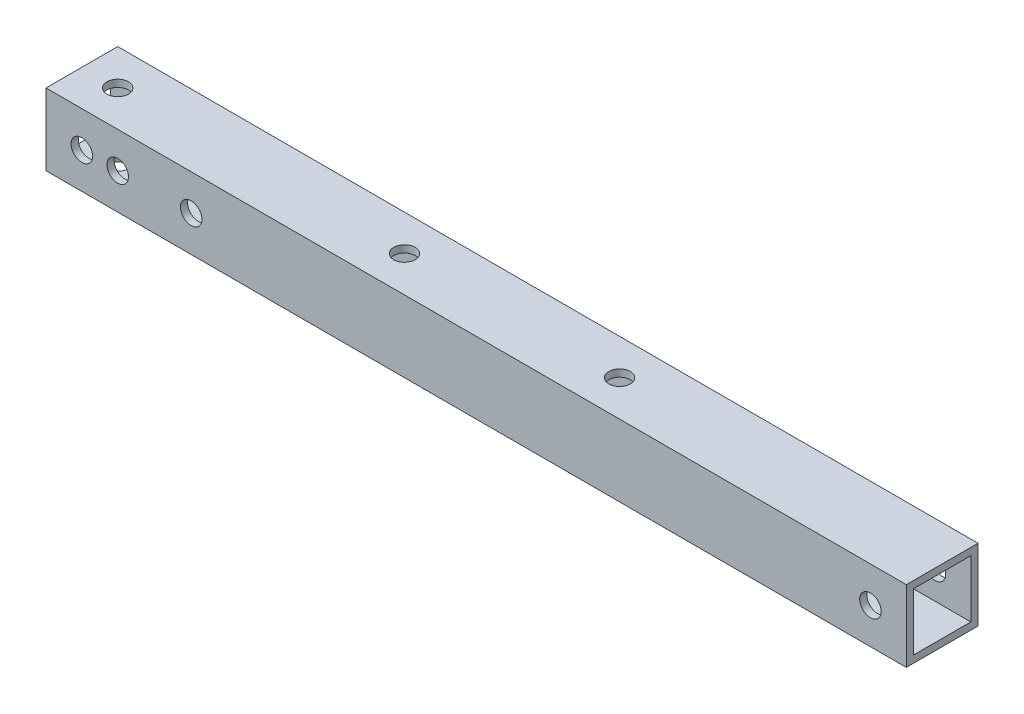
ISO-10303-21;
HEADER;
FILE_DESCRIPTION(('STEP AP214'),'2;1');
FILE_NAME('part.step','',(''),(''),'','','');
FILE_SCHEMA(('AUTOMOTIVE_DESIGN { 1 0 10303 214 1 1 1 1 }'));
ENDSEC;
DATA;
#1=APPLICATION_CONTEXT('core data for automotive mechanical design processes');
#2=APPLICATION_PROTOCOL_DEFINITION('international standard','automotive_design',2000,#1);
#3=PRODUCT_CONTEXT('',#1,'mechanical');
#4=PRODUCT('Part','Part','',(#3));
#5=PRODUCT_RELATED_PRODUCT_CATEGORY('part','',(#4));
#6=PRODUCT_DEFINITION_FORMATION('','',#4);
#7=PRODUCT_DEFINITION_CONTEXT('part definition',#1,'design');
#8=PRODUCT_DEFINITION('design','',#6,#7);
#9=PRODUCT_DEFINITION_SHAPE('','',#8);
#10=(LENGTH_UNIT() NAMED_UNIT(*) SI_UNIT(.MILLI.,.METRE.));
#11=(NAMED_UNIT(*) PLANE_ANGLE_UNIT() SI_UNIT($,.RADIAN.));
#12=(NAMED_UNIT(*) SI_UNIT($,.STERADIAN.) SOLID_ANGLE_UNIT());
#13=UNCERTAINTY_MEASURE_WITH_UNIT(LENGTH_MEASURE(1.E-05),#10,'distance_accuracy_value','');
#14=(GEOMETRIC_REPRESENTATION_CONTEXT(3) GLOBAL_UNCERTAINTY_ASSIGNED_CONTEXT((#13)) GLOBAL_UNIT_ASSIGNED_CONTEXT((#10,
#11,#12)) REPRESENTATION_CONTEXT('',''));
#15=CARTESIAN_POINT('',(0.,0.,0.));
#16=DIRECTION('',(0.,0.,1.));
#17=DIRECTION('',(1.,0.,0.));
#18=AXIS2_PLACEMENT_3D('',#15,#16,#17);
#19=CARTESIAN_POINT('',(120.,0.,0.));
#20=DIRECTION('',(1.,0.,0.));
#21=DIRECTION('',(0.,0.,-1.));
#22=AXIS2_PLACEMENT_3D('',#19,#20,#21);
#23=PLANE('',#22);
#24=DIRECTION('',(0.,1.,0.));
#25=VECTOR('',#24,1.);
#26=CARTESIAN_POINT('',(120.,-5.,-5.));
#27=LINE('',#26,#25);
#28=CARTESIAN_POINT('',(120.,-5.,-5.));
#29=VERTEX_POINT('',#28);
#30=CARTESIAN_POINT('',(120.,5.,-5.));
#31=VERTEX_POINT('',#30);
#32=EDGE_CURVE('E181',#29,#31,#27,.T.);
#33=ORIENTED_EDGE('',*,*,#32,.T.);
#34=DIRECTION('',(0.,0.,1.));
#35=VECTOR('',#34,1.);
#36=CARTESIAN_POINT('',(120.,5.,5.));
#37=LINE('',#36,#35);
#38=CARTESIAN_POINT('',(120.,5.,5.));
#39=VERTEX_POINT('',#38);
#40=EDGE_CURVE('E185',#31,#39,#37,.T.);
#41=ORIENTED_EDGE('',*,*,#40,.T.);
#42=DIRECTION('',(0.,-1.,0.));
#43=VECTOR('',#42,1.);
#44=CARTESIAN_POINT('',(120.,-5.,5.));
#45=LINE('',#44,#43);
#46=CARTESIAN_POINT('',(120.,-5.,5.));
#47=VERTEX_POINT('',#46);
#48=EDGE_CURVE('E189',#39,#47,#45,.T.);
#49=ORIENTED_EDGE('',*,*,#48,.T.);
#50=DIRECTION('',(0.,0.,-1.));
#51=VECTOR('',#50,1.);
#52=CARTESIAN_POINT('',(120.,-5.,5.));
#53=LINE('',#52,#51);
#54=EDGE_CURVE('E192',#47,#29,#53,.T.);
#55=ORIENTED_EDGE('',*,*,#54,.T.);
#56=EDGE_LOOP('',(#33,#41,#49,#55));
#57=FACE_BOUND('',#56,.T.);
#58=DIRECTION('',(0.,0.,1.));
#59=VECTOR('',#58,1.);
#60=CARTESIAN_POINT('',(120.,4.,0.));
#61=LINE('',#60,#59);
#62=CARTESIAN_POINT('',(120.,4.,-4.));
#63=VERTEX_POINT('',#62);
#64=CARTESIAN_POINT('',(120.,4.,4.));
#65=VERTEX_POINT('',#64);
#66=EDGE_CURVE('E140',#63,#65,#61,.T.);
#67=ORIENTED_EDGE('',*,*,#66,.F.);
#68=DIRECTION('',(0.,1.,0.));
#69=VECTOR('',#68,1.);
#70=CARTESIAN_POINT('',(120.,0.,-4.));
#71=LINE('',#70,#69);
#72=CARTESIAN_POINT('',(120.,-4.,-4.));
#73=VERTEX_POINT('',#72);
#74=EDGE_CURVE('E131',#73,#63,#71,.T.);
#75=ORIENTED_EDGE('',*,*,#74,.F.);
#76=DIRECTION('',(0.,0.,-1.));
#77=VECTOR('',#76,1.);
#78=CARTESIAN_POINT('',(120.,-4.,0.));
#79=LINE('',#78,#77);
#80=CARTESIAN_POINT('',(120.,-4.,4.));
#81=VERTEX_POINT('',#80);
#82=EDGE_CURVE('E157',#81,#73,#79,.T.);
#83=ORIENTED_EDGE('',*,*,#82,.F.);
#84=DIRECTION('',(0.,-1.,0.));
#85=VECTOR('',#84,1.);
#86=CARTESIAN_POINT('',(120.,0.,4.));
#87=LINE('',#86,#85);
#88=EDGE_CURVE('E153',#65,#81,#87,.T.);
#89=ORIENTED_EDGE('',*,*,#88,.F.);
#90=EDGE_LOOP('',(#67,#75,#83,#89));
#91=FACE_BOUND('',#90,.T.);
#92=ADVANCED_FACE('F63',(#57,#91),#23,.T.);
#93=CARTESIAN_POINT('',(0.,0.,0.));
#94=DIRECTION('',(1.,0.,0.));
#95=DIRECTION('',(0.,0.,-1.));
#96=AXIS2_PLACEMENT_3D('',#93,#94,#95);
#97=PLANE('',#96);
#98=DIRECTION('',(0.,1.,0.));
#99=VECTOR('',#98,1.);
#100=CARTESIAN_POINT('',(0.,-5.,-5.));
#101=LINE('',#100,#99);
#102=CARTESIAN_POINT('',(0.,-5.,-5.));
#103=VERTEX_POINT('',#102);
#104=CARTESIAN_POINT('',(0.,5.,-5.));
#105=VERTEX_POINT('',#104);
#106=EDGE_CURVE('E149',#103,#105,#101,.T.);
#107=ORIENTED_EDGE('',*,*,#106,.F.);
#108=DIRECTION('',(0.,0.,-1.));
#109=VECTOR('',#108,1.);
#110=CARTESIAN_POINT('',(0.,-5.,5.));
#111=LINE('',#110,#109);
#112=CARTESIAN_POINT('',(0.,-5.,5.));
#113=VERTEX_POINT('',#112);
#114=EDGE_CURVE('E186',#113,#103,#111,.T.);
#115=ORIENTED_EDGE('',*,*,#114,.F.);
#116=DIRECTION('',(0.,-1.,0.));
#117=VECTOR('',#116,1.);
#118=CARTESIAN_POINT('',(0.,-5.,5.));
#119=LINE('',#118,#117);
#120=CARTESIAN_POINT('',(0.,5.,5.));
#121=VERTEX_POINT('',#120);
#122=EDGE_CURVE('E202',#121,#113,#119,.T.);
#123=ORIENTED_EDGE('',*,*,#122,.F.);
#124=DIRECTION('',(0.,0.,1.));
#125=VECTOR('',#124,1.);
#126=CARTESIAN_POINT('',(0.,5.,5.));
#127=LINE('',#126,#125);
#128=EDGE_CURVE('E199',#105,#121,#127,.T.);
#129=ORIENTED_EDGE('',*,*,#128,.F.);
#130=EDGE_LOOP('',(#107,#115,#123,#129));
#131=FACE_BOUND('',#130,.T.);
#132=DIRECTION('',(0.,1.,0.));
#133=VECTOR('',#132,1.);
#134=CARTESIAN_POINT('',(0.,0.,-4.));
#135=LINE('',#134,#133);
#136=CARTESIAN_POINT('',(0.,-4.,-4.));
#137=VERTEX_POINT('',#136);
#138=CARTESIAN_POINT('',(0.,4.,-4.));
#139=VERTEX_POINT('',#138);
#140=EDGE_CURVE('E89',#137,#139,#135,.T.);
#141=ORIENTED_EDGE('',*,*,#140,.T.);
#142=DIRECTION('',(0.,0.,1.));
#143=VECTOR('',#142,1.);
#144=CARTESIAN_POINT('',(0.,4.,0.));
#145=LINE('',#144,#143);
#146=CARTESIAN_POINT('',(0.,4.,4.));
#147=VERTEX_POINT('',#146);
#148=EDGE_CURVE('E147',#139,#147,#145,.T.);
#149=ORIENTED_EDGE('',*,*,#148,.T.);
#150=DIRECTION('',(0.,-1.,0.));
#151=VECTOR('',#150,1.);
#152=CARTESIAN_POINT('',(0.,0.,4.));
#153=LINE('',#152,#151);
#154=CARTESIAN_POINT('',(0.,-4.,4.));
#155=VERTEX_POINT('',#154);
#156=EDGE_CURVE('E168',#147,#155,#153,.T.);
#157=ORIENTED_EDGE('',*,*,#156,.T.);
#158=DIRECTION('',(0.,0.,-1.));
#159=VECTOR('',#158,1.);
#160=CARTESIAN_POINT('',(0.,-4.,0.));
#161=LINE('',#160,#159);
#162=EDGE_CURVE('E141',#155,#137,#161,.T.);
#163=ORIENTED_EDGE('',*,*,#162,.T.);
#164=EDGE_LOOP('',(#141,#149,#157,#163));
#165=FACE_BOUND('',#164,.T.);
#166=ADVANCED_FACE('F332',(#131,#165),#97,.F.);
#167=CARTESIAN_POINT('',(120.,-5.,-5.));
#168=DIRECTION('',(0.,0.,1.));
#169=DIRECTION('',(1.,0.,0.));
#170=AXIS2_PLACEMENT_3D('',#167,#168,#169);
#171=PLANE('',#170);
#172=CARTESIAN_POINT('',(115.,0.,-5.));
#173=DIRECTION('',(0.,0.,1.));
#174=DIRECTION('',(1.,0.,0.));
#175=AXIS2_PLACEMENT_3D('',#172,#173,#174);
#176=CIRCLE('',#175,1.5);
#177=CARTESIAN_POINT('',(116.5,0.,-5.));
#178=VERTEX_POINT('',#177);
#179=EDGE_CURVE('E222',#178,#178,#176,.T.);
#180=ORIENTED_EDGE('',*,*,#179,.T.);
#181=EDGE_LOOP('',(#180));
#182=FACE_BOUND('',#181,.T.);
#183=CARTESIAN_POINT('',(10.,0.,-5.));
#184=DIRECTION('',(0.,0.,1.));
#185=DIRECTION('',(1.,0.,0.));
#186=AXIS2_PLACEMENT_3D('',#183,#184,#185);
#187=CIRCLE('',#186,1.5);
#188=CARTESIAN_POINT('',(11.5,0.,-5.));
#189=VERTEX_POINT('',#188);
#190=EDGE_CURVE('E272',#189,#189,#187,.T.);
#191=ORIENTED_EDGE('',*,*,#190,.T.);
#192=EDGE_LOOP('',(#191));
#193=FACE_BOUND('',#192,.T.);
#194=CARTESIAN_POINT('',(20.25,0.,-5.));
#195=DIRECTION('',(0.,0.,1.));
#196=DIRECTION('',(1.,0.,0.));
#197=AXIS2_PLACEMENT_3D('',#194,#195,#196);
#198=CIRCLE('',#197,1.5);
#199=CARTESIAN_POINT('',(21.75,0.,-5.));
#200=VERTEX_POINT('',#199);
#201=EDGE_CURVE('E280',#200,#200,#198,.T.);
#202=ORIENTED_EDGE('',*,*,#201,.T.);
#203=EDGE_LOOP('',(#202));
#204=FACE_BOUND('',#203,.T.);
#205=CARTESIAN_POINT('',(5.,0.,-5.));
#206=DIRECTION('',(0.,0.,1.));
#207=DIRECTION('',(1.,0.,0.));
#208=AXIS2_PLACEMENT_3D('',#205,#206,#207);
#209=CIRCLE('',#208,1.5);
#210=CARTESIAN_POINT('',(6.5,0.,-5.));
#211=VERTEX_POINT('',#210);
#212=EDGE_CURVE('E288',#211,#211,#209,.T.);
#213=ORIENTED_EDGE('',*,*,#212,.T.);
#214=EDGE_LOOP('',(#213));
#215=FACE_BOUND('',#214,.T.);
#216=ORIENTED_EDGE('',*,*,#106,.T.);
#217=DIRECTION('',(-1.,0.,0.));
#218=VECTOR('',#217,1.);
#219=CARTESIAN_POINT('',(120.,5.,-5.));
#220=LINE('',#219,#218);
#221=EDGE_CURVE('E12',#31,#105,#220,.T.);
#222=ORIENTED_EDGE('',*,*,#221,.F.);
#223=ORIENTED_EDGE('',*,*,#32,.F.);
#224=DIRECTION('',(-1.,0.,0.));
#225=VECTOR('',#224,1.);
#226=CARTESIAN_POINT('',(120.,-5.,-5.));
#227=LINE('',#226,#225);
#228=EDGE_CURVE('E195',#29,#103,#227,.T.);
#229=ORIENTED_EDGE('',*,*,#228,.T.);
#230=EDGE_LOOP('',(#216,#222,#223,#229));
#231=FACE_BOUND('',#230,.T.);
#232=ADVANCED_FACE('F65',(#182,#193,#204,#215,#231),#171,.F.);
#233=CARTESIAN_POINT('',(120.,5.,5.));
#234=DIRECTION('',(0.,-1.,0.));
#235=DIRECTION('',(0.,0.,-1.));
#236=AXIS2_PLACEMENT_3D('',#233,#234,#235);
#237=PLANE('',#236);
#238=CARTESIAN_POINT('',(5.,5.,0.));
#239=DIRECTION('',(0.,1.,0.));
#240=DIRECTION('',(0.,0.,1.));
#241=AXIS2_PLACEMENT_3D('',#238,#239,#240);
#242=CIRCLE('',#241,1.5);
#243=CARTESIAN_POINT('',(5.,5.,1.5));
#244=VERTEX_POINT('',#243);
#245=EDGE_CURVE('E423',#244,#244,#242,.T.);
#246=ORIENTED_EDGE('',*,*,#245,.F.);
#247=EDGE_LOOP('',(#246));
#248=FACE_BOUND('',#247,.T.);
#249=CARTESIAN_POINT('',(45.,5.,0.));
#250=DIRECTION('',(0.,1.,0.));
#251=DIRECTION('',(0.,0.,1.));
#252=AXIS2_PLACEMENT_3D('',#249,#250,#251);
#253=CIRCLE('',#252,1.5);
#254=CARTESIAN_POINT('',(45.,5.,1.5));
#255=VERTEX_POINT('',#254);
#256=EDGE_CURVE('E432',#255,#255,#253,.T.);
#257=ORIENTED_EDGE('',*,*,#256,.F.);
#258=EDGE_LOOP('',(#257));
#259=FACE_BOUND('',#258,.T.);
#260=CARTESIAN_POINT('',(75.,5.,0.));
#261=DIRECTION('',(0.,1.,0.));
#262=DIRECTION('',(0.,0.,-1.));
#263=AXIS2_PLACEMENT_3D('',#260,#261,#262);
#264=CIRCLE('',#263,1.5);
#265=CARTESIAN_POINT('',(75.,5.,-1.5));
#266=VERTEX_POINT('',#265);
#267=EDGE_CURVE('E257',#266,#266,#264,.T.);
#268=ORIENTED_EDGE('',*,*,#267,.F.);
#269=EDGE_LOOP('',(#268));
#270=FACE_BOUND('',#269,.T.);
#271=ORIENTED_EDGE('',*,*,#128,.T.);
#272=DIRECTION('',(-1.,0.,0.));
#273=VECTOR('',#272,1.);
#274=CARTESIAN_POINT('',(120.,5.,5.));
#275=LINE('',#274,#273);
#276=EDGE_CURVE('E73',#39,#121,#275,.T.);
#277=ORIENTED_EDGE('',*,*,#276,.F.);
#278=ORIENTED_EDGE('',*,*,#40,.F.);
#279=ORIENTED_EDGE('',*,*,#221,.T.);
#280=EDGE_LOOP('',(#271,#277,#278,#279));
#281=FACE_BOUND('',#280,.T.);
#282=ADVANCED_FACE('F331',(#248,#259,#270,#281),#237,.F.);
#283=CARTESIAN_POINT('',(120.,-5.,5.));
#284=DIRECTION('',(0.,0.,-1.));
#285=DIRECTION('',(-1.,0.,0.));
#286=AXIS2_PLACEMENT_3D('',#283,#284,#285);
#287=PLANE('',#286);
#288=CARTESIAN_POINT('',(115.,0.,5.));
#289=DIRECTION('',(0.,0.,1.));
#290=DIRECTION('',(1.,0.,0.));
#291=AXIS2_PLACEMENT_3D('',#288,#289,#290);
#292=CIRCLE('',#291,1.5);
#293=CARTESIAN_POINT('',(116.5,0.,5.));
#294=VERTEX_POINT('',#293);
#295=EDGE_CURVE('E268',#294,#294,#292,.T.);
#296=ORIENTED_EDGE('',*,*,#295,.F.);
#297=EDGE_LOOP('',(#296));
#298=FACE_BOUND('',#297,.T.);
#299=CARTESIAN_POINT('',(10.,0.,5.));
#300=DIRECTION('',(0.,0.,1.));
#301=DIRECTION('',(1.,0.,0.));
#302=AXIS2_PLACEMENT_3D('',#299,#300,#301);
#303=CIRCLE('',#302,1.5);
#304=CARTESIAN_POINT('',(11.5,0.,5.));
#305=VERTEX_POINT('',#304);
#306=EDGE_CURVE('E276',#305,#305,#303,.T.);
#307=ORIENTED_EDGE('',*,*,#306,.F.);
#308=EDGE_LOOP('',(#307));
#309=FACE_BOUND('',#308,.T.);
#310=CARTESIAN_POINT('',(20.25,0.,5.));
#311=DIRECTION('',(0.,0.,1.));
#312=DIRECTION('',(1.,0.,0.));
#313=AXIS2_PLACEMENT_3D('',#310,#311,#312);
#314=CIRCLE('',#313,1.5);
#315=CARTESIAN_POINT('',(21.75,0.,5.));
#316=VERTEX_POINT('',#315);
#317=EDGE_CURVE('E284',#316,#316,#314,.T.);
#318=ORIENTED_EDGE('',*,*,#317,.F.);
#319=EDGE_LOOP('',(#318));
#320=FACE_BOUND('',#319,.T.);
#321=CARTESIAN_POINT('',(5.,0.,5.));
#322=DIRECTION('',(0.,0.,1.));
#323=DIRECTION('',(1.,0.,0.));
#324=AXIS2_PLACEMENT_3D('',#321,#322,#323);
#325=CIRCLE('',#324,1.5);
#326=CARTESIAN_POINT('',(6.5,0.,5.));
#327=VERTEX_POINT('',#326);
#328=EDGE_CURVE('E264',#327,#327,#325,.T.);
#329=ORIENTED_EDGE('',*,*,#328,.F.);
#330=EDGE_LOOP('',(#329));
#331=FACE_BOUND('',#330,.T.);
#332=ORIENTED_EDGE('',*,*,#122,.T.);
#333=DIRECTION('',(-1.,0.,0.));
#334=VECTOR('',#333,1.);
#335=CARTESIAN_POINT('',(120.,-5.,5.));
#336=LINE('',#335,#334);
#337=EDGE_CURVE('E210',#47,#113,#336,.T.);
#338=ORIENTED_EDGE('',*,*,#337,.F.);
#339=ORIENTED_EDGE('',*,*,#48,.F.);
#340=ORIENTED_EDGE('',*,*,#276,.T.);
#341=EDGE_LOOP('',(#332,#338,#339,#340));
#342=FACE_BOUND('',#341,.T.);
#343=ADVANCED_FACE('F350',(#298,#309,#320,#331,#342),#287,.F.);
#344=CARTESIAN_POINT('',(120.,-5.,5.));
#345=DIRECTION('',(0.,1.,0.));
#346=DIRECTION('',(0.,0.,1.));
#347=AXIS2_PLACEMENT_3D('',#344,#345,#346);
#348=PLANE('',#347);
#349=CARTESIAN_POINT('',(5.,-5.,0.));
#350=DIRECTION('',(0.,1.,0.));
#351=DIRECTION('',(0.,0.,1.));
#352=AXIS2_PLACEMENT_3D('',#349,#350,#351);
#353=CIRCLE('',#352,1.5);
#354=CARTESIAN_POINT('',(5.,-5.,1.5));
#355=VERTEX_POINT('',#354);
#356=EDGE_CURVE('E241',#355,#355,#353,.T.);
#357=ORIENTED_EDGE('',*,*,#356,.T.);
#358=EDGE_LOOP('',(#357));
#359=FACE_BOUND('',#358,.T.);
#360=CARTESIAN_POINT('',(45.,-5.,0.));
#361=DIRECTION('',(0.,1.,0.));
#362=DIRECTION('',(0.,0.,1.));
#363=AXIS2_PLACEMENT_3D('',#360,#361,#362);
#364=CIRCLE('',#363,1.5);
#365=CARTESIAN_POINT('',(45.,-5.,1.5));
#366=VERTEX_POINT('',#365);
#367=EDGE_CURVE('E425',#366,#366,#364,.T.);
#368=ORIENTED_EDGE('',*,*,#367,.T.);
#369=EDGE_LOOP('',(#368));
#370=FACE_BOUND('',#369,.T.);
#371=CARTESIAN_POINT('',(75.,-5.,0.));
#372=DIRECTION('',(0.,1.,0.));
#373=DIRECTION('',(0.,0.,-1.));
#374=AXIS2_PLACEMENT_3D('',#371,#372,#373);
#375=CIRCLE('',#374,1.5);
#376=CARTESIAN_POINT('',(75.,-5.,-1.5));
#377=VERTEX_POINT('',#376);
#378=EDGE_CURVE('E437',#377,#377,#375,.T.);
#379=ORIENTED_EDGE('',*,*,#378,.T.);
#380=EDGE_LOOP('',(#379));
#381=FACE_BOUND('',#380,.T.);
#382=ORIENTED_EDGE('',*,*,#114,.T.);
#383=ORIENTED_EDGE('',*,*,#228,.F.);
#384=ORIENTED_EDGE('',*,*,#54,.F.);
#385=ORIENTED_EDGE('',*,*,#337,.T.);
#386=EDGE_LOOP('',(#382,#383,#384,#385));
#387=FACE_BOUND('',#386,.T.);
#388=ADVANCED_FACE('F312',(#359,#370,#381,#387),#348,.F.);
#389=CARTESIAN_POINT('',(120.,0.,-4.));
#390=DIRECTION('',(0.,0.,1.));
#391=DIRECTION('',(1.,0.,0.));
#392=AXIS2_PLACEMENT_3D('',#389,#390,#391);
#393=PLANE('',#392);
#394=CARTESIAN_POINT('',(115.,0.,-4.));
#395=DIRECTION('',(0.,0.,1.));
#396=DIRECTION('',(1.,0.,0.));
#397=AXIS2_PLACEMENT_3D('',#394,#395,#396);
#398=CIRCLE('',#397,1.5);
#399=CARTESIAN_POINT('',(116.5,0.,-4.));
#400=VERTEX_POINT('',#399);
#401=EDGE_CURVE('E165',#400,#400,#398,.T.);
#402=ORIENTED_EDGE('',*,*,#401,.F.);
#403=EDGE_LOOP('',(#402));
#404=FACE_BOUND('',#403,.T.);
#405=CARTESIAN_POINT('',(10.,0.,-4.));
#406=DIRECTION('',(0.,0.,1.));
#407=DIRECTION('',(1.,0.,0.));
#408=AXIS2_PLACEMENT_3D('',#405,#406,#407);
#409=CIRCLE('',#408,1.5);
#410=CARTESIAN_POINT('',(11.5,0.,-4.));
#411=VERTEX_POINT('',#410);
#412=EDGE_CURVE('E232',#411,#411,#409,.T.);
#413=ORIENTED_EDGE('',*,*,#412,.F.);
#414=EDGE_LOOP('',(#413));
#415=FACE_BOUND('',#414,.T.);
#416=CARTESIAN_POINT('',(20.25,0.,-4.));
#417=DIRECTION('',(0.,0.,1.));
#418=DIRECTION('',(1.,0.,0.));
#419=AXIS2_PLACEMENT_3D('',#416,#417,#418);
#420=CIRCLE('',#419,1.5);
#421=CARTESIAN_POINT('',(21.75,0.,-4.));
#422=VERTEX_POINT('',#421);
#423=EDGE_CURVE('E227',#422,#422,#420,.T.);
#424=ORIENTED_EDGE('',*,*,#423,.F.);
#425=EDGE_LOOP('',(#424));
#426=FACE_BOUND('',#425,.T.);
#427=CARTESIAN_POINT('',(5.,0.,-4.));
#428=DIRECTION('',(0.,0.,1.));
#429=DIRECTION('',(1.,0.,0.));
#430=AXIS2_PLACEMENT_3D('',#427,#428,#429);
#431=CIRCLE('',#430,1.5);
#432=CARTESIAN_POINT('',(6.5,0.,-4.));
#433=VERTEX_POINT('',#432);
#434=EDGE_CURVE('E221',#433,#433,#431,.T.);
#435=ORIENTED_EDGE('',*,*,#434,.F.);
#436=EDGE_LOOP('',(#435));
#437=FACE_BOUND('',#436,.T.);
#438=ORIENTED_EDGE('',*,*,#140,.F.);
#439=DIRECTION('',(-1.,0.,0.));
#440=VECTOR('',#439,1.);
#441=CARTESIAN_POINT('',(120.,-4.,-4.));
#442=LINE('',#441,#440);
#443=EDGE_CURVE('E135',#73,#137,#442,.T.);
#444=ORIENTED_EDGE('',*,*,#443,.F.);
#445=ORIENTED_EDGE('',*,*,#74,.T.);
#446=DIRECTION('',(-1.,0.,0.));
#447=VECTOR('',#446,1.);
#448=CARTESIAN_POINT('',(120.,4.,-4.));
#449=LINE('',#448,#447);
#450=EDGE_CURVE('E134',#63,#139,#449,.T.);
#451=ORIENTED_EDGE('',*,*,#450,.T.);
#452=EDGE_LOOP('',(#438,#444,#445,#451));
#453=FACE_BOUND('',#452,.T.);
#454=ADVANCED_FACE('F133',(#404,#415,#426,#437,#453),#393,.T.);
#455=CARTESIAN_POINT('',(120.,4.,0.));
#456=DIRECTION('',(0.,-1.,0.));
#457=DIRECTION('',(0.,0.,-1.));
#458=AXIS2_PLACEMENT_3D('',#455,#456,#457);
#459=PLANE('',#458);
#460=CARTESIAN_POINT('',(5.,4.,0.));
#461=DIRECTION('',(0.,-1.,0.));
#462=DIRECTION('',(0.,0.,-1.));
#463=AXIS2_PLACEMENT_3D('',#460,#461,#462);
#464=CIRCLE('',#463,1.5);
#465=CARTESIAN_POINT('',(5.,4.,-1.5));
#466=VERTEX_POINT('',#465);
#467=EDGE_CURVE('E260',#466,#466,#464,.T.);
#468=ORIENTED_EDGE('',*,*,#467,.F.);
#469=EDGE_LOOP('',(#468));
#470=FACE_BOUND('',#469,.T.);
#471=CARTESIAN_POINT('',(45.,4.,0.));
#472=DIRECTION('',(0.,-1.,0.));
#473=DIRECTION('',(0.,0.,-1.));
#474=AXIS2_PLACEMENT_3D('',#471,#472,#473);
#475=CIRCLE('',#474,1.5);
#476=CARTESIAN_POINT('',(45.,4.,-1.5));
#477=VERTEX_POINT('',#476);
#478=EDGE_CURVE('E245',#477,#477,#475,.T.);
#479=ORIENTED_EDGE('',*,*,#478,.F.);
#480=EDGE_LOOP('',(#479));
#481=FACE_BOUND('',#480,.T.);
#482=CARTESIAN_POINT('',(75.,4.,0.));
#483=DIRECTION('',(0.,-1.,0.));
#484=DIRECTION('',(0.,0.,-1.));
#485=AXIS2_PLACEMENT_3D('',#482,#483,#484);
#486=CIRCLE('',#485,1.5);
#487=CARTESIAN_POINT('',(75.,4.,-1.5));
#488=VERTEX_POINT('',#487);
#489=EDGE_CURVE('E240',#488,#488,#486,.T.);
#490=ORIENTED_EDGE('',*,*,#489,.F.);
#491=EDGE_LOOP('',(#490));
#492=FACE_BOUND('',#491,.T.);
#493=ORIENTED_EDGE('',*,*,#148,.F.);
#494=ORIENTED_EDGE('',*,*,#450,.F.);
#495=ORIENTED_EDGE('',*,*,#66,.T.);
#496=DIRECTION('',(-1.,0.,0.));
#497=VECTOR('',#496,1.);
#498=CARTESIAN_POINT('',(120.,4.,4.));
#499=LINE('',#498,#497);
#500=EDGE_CURVE('E150',#65,#147,#499,.T.);
#501=ORIENTED_EDGE('',*,*,#500,.T.);
#502=EDGE_LOOP('',(#493,#494,#495,#501));
#503=FACE_BOUND('',#502,.T.);
#504=ADVANCED_FACE('F144',(#470,#481,#492,#503),#459,.T.);
#505=CARTESIAN_POINT('',(120.,0.,4.));
#506=DIRECTION('',(0.,0.,-1.));
#507=DIRECTION('',(-1.,0.,0.));
#508=AXIS2_PLACEMENT_3D('',#505,#506,#507);
#509=PLANE('',#508);
#510=CARTESIAN_POINT('',(115.,0.,4.));
#511=DIRECTION('',(0.,0.,-1.));
#512=DIRECTION('',(-1.,0.,0.));
#513=AXIS2_PLACEMENT_3D('',#510,#511,#512);
#514=CIRCLE('',#513,1.5);
#515=CARTESIAN_POINT('',(113.5,0.,4.));
#516=VERTEX_POINT('',#515);
#517=EDGE_CURVE('E233',#516,#516,#514,.T.);
#518=ORIENTED_EDGE('',*,*,#517,.F.);
#519=EDGE_LOOP('',(#518));
#520=FACE_BOUND('',#519,.T.);
#521=CARTESIAN_POINT('',(10.,0.,4.));
#522=DIRECTION('',(0.,0.,-1.));
#523=DIRECTION('',(-1.,0.,0.));
#524=AXIS2_PLACEMENT_3D('',#521,#522,#523);
#525=CIRCLE('',#524,1.5);
#526=CARTESIAN_POINT('',(8.5,0.,4.));
#527=VERTEX_POINT('',#526);
#528=EDGE_CURVE('E228',#527,#527,#525,.T.);
#529=ORIENTED_EDGE('',*,*,#528,.F.);
#530=EDGE_LOOP('',(#529));
#531=FACE_BOUND('',#530,.T.);
#532=CARTESIAN_POINT('',(20.25,0.,4.));
#533=DIRECTION('',(0.,0.,-1.));
#534=DIRECTION('',(-1.,0.,0.));
#535=AXIS2_PLACEMENT_3D('',#532,#533,#534);
#536=CIRCLE('',#535,1.5);
#537=CARTESIAN_POINT('',(18.75,0.,4.));
#538=VERTEX_POINT('',#537);
#539=EDGE_CURVE('E223',#538,#538,#536,.T.);
#540=ORIENTED_EDGE('',*,*,#539,.F.);
#541=EDGE_LOOP('',(#540));
#542=FACE_BOUND('',#541,.T.);
#543=CARTESIAN_POINT('',(5.,0.,4.));
#544=DIRECTION('',(0.,0.,-1.));
#545=DIRECTION('',(-1.,0.,0.));
#546=AXIS2_PLACEMENT_3D('',#543,#544,#545);
#547=CIRCLE('',#546,1.5);
#548=CARTESIAN_POINT('',(3.5,0.,4.));
#549=VERTEX_POINT('',#548);
#550=EDGE_CURVE('E217',#549,#549,#547,.T.);
#551=ORIENTED_EDGE('',*,*,#550,.F.);
#552=EDGE_LOOP('',(#551));
#553=FACE_BOUND('',#552,.T.);
#554=ORIENTED_EDGE('',*,*,#156,.F.);
#555=ORIENTED_EDGE('',*,*,#500,.F.);
#556=ORIENTED_EDGE('',*,*,#88,.T.);
#557=DIRECTION('',(-1.,0.,0.));
#558=VECTOR('',#557,1.);
#559=CARTESIAN_POINT('',(120.,-4.,4.));
#560=LINE('',#559,#558);
#561=EDGE_CURVE('E81',#81,#155,#560,.T.);
#562=ORIENTED_EDGE('',*,*,#561,.T.);
#563=EDGE_LOOP('',(#554,#555,#556,#562));
#564=FACE_BOUND('',#563,.T.);
#565=ADVANCED_FACE('F372',(#520,#531,#542,#553,#564),#509,.T.);
#566=CARTESIAN_POINT('',(120.,-4.,0.));
#567=DIRECTION('',(0.,1.,0.));
#568=DIRECTION('',(0.,0.,1.));
#569=AXIS2_PLACEMENT_3D('',#566,#567,#568);
#570=PLANE('',#569);
#571=CARTESIAN_POINT('',(5.,-4.,0.));
#572=DIRECTION('',(0.,1.,0.));
#573=DIRECTION('',(0.,0.,1.));
#574=AXIS2_PLACEMENT_3D('',#571,#572,#573);
#575=CIRCLE('',#574,1.5);
#576=CARTESIAN_POINT('',(5.,-4.,1.5));
#577=VERTEX_POINT('',#576);
#578=EDGE_CURVE('E67',#577,#577,#575,.T.);
#579=ORIENTED_EDGE('',*,*,#578,.F.);
#580=EDGE_LOOP('',(#579));
#581=FACE_BOUND('',#580,.T.);
#582=CARTESIAN_POINT('',(45.,-4.,0.));
#583=DIRECTION('',(0.,1.,0.));
#584=DIRECTION('',(0.,0.,1.));
#585=AXIS2_PLACEMENT_3D('',#582,#583,#584);
#586=CIRCLE('',#585,1.5);
#587=CARTESIAN_POINT('',(45.,-4.,1.5));
#588=VERTEX_POINT('',#587);
#589=EDGE_CURVE('E242',#588,#588,#586,.T.);
#590=ORIENTED_EDGE('',*,*,#589,.F.);
#591=EDGE_LOOP('',(#590));
#592=FACE_BOUND('',#591,.T.);
#593=CARTESIAN_POINT('',(75.,-4.,0.));
#594=DIRECTION('',(0.,1.,0.));
#595=DIRECTION('',(0.,0.,1.));
#596=AXIS2_PLACEMENT_3D('',#593,#594,#595);
#597=CIRCLE('',#596,1.5);
#598=CARTESIAN_POINT('',(75.,-4.,1.49999999999999));
#599=VERTEX_POINT('',#598);
#600=EDGE_CURVE('E237',#599,#599,#597,.T.);
#601=ORIENTED_EDGE('',*,*,#600,.F.);
#602=EDGE_LOOP('',(#601));
#603=FACE_BOUND('',#602,.T.);
#604=ORIENTED_EDGE('',*,*,#162,.F.);
#605=ORIENTED_EDGE('',*,*,#561,.F.);
#606=ORIENTED_EDGE('',*,*,#82,.T.);
#607=ORIENTED_EDGE('',*,*,#443,.T.);
#608=EDGE_LOOP('',(#604,#605,#606,#607));
#609=FACE_BOUND('',#608,.T.);
#610=ADVANCED_FACE('F376',(#581,#592,#603,#609),#570,.T.);
#611=CARTESIAN_POINT('',(5.,0.,-5.));
#612=DIRECTION('',(0.,0.,1.));
#613=DIRECTION('',(1.,0.,0.));
#614=AXIS2_PLACEMENT_3D('',#611,#612,#613);
#615=CYLINDRICAL_SURFACE('',#614,1.5);
#616=ORIENTED_EDGE('',*,*,#550,.T.);
#617=EDGE_LOOP('',(#616));
#618=FACE_BOUND('',#617,.T.);
#619=ORIENTED_EDGE('',*,*,#328,.T.);
#620=EDGE_LOOP('',(#619));
#621=FACE_BOUND('',#620,.T.);
#622=ADVANCED_FACE('F326',(#618,#621),#615,.F.);
#623=CARTESIAN_POINT('',(20.25,0.,-5.));
#624=DIRECTION('',(0.,0.,1.));
#625=DIRECTION('',(1.,0.,0.));
#626=AXIS2_PLACEMENT_3D('',#623,#624,#625);
#627=CYLINDRICAL_SURFACE('',#626,1.5);
#628=ORIENTED_EDGE('',*,*,#539,.T.);
#629=EDGE_LOOP('',(#628));
#630=FACE_BOUND('',#629,.T.);
#631=ORIENTED_EDGE('',*,*,#317,.T.);
#632=EDGE_LOOP('',(#631));
#633=FACE_BOUND('',#632,.T.);
#634=ADVANCED_FACE('F382',(#630,#633),#627,.F.);
#635=CARTESIAN_POINT('',(10.,0.,-5.));
#636=DIRECTION('',(0.,0.,1.));
#637=DIRECTION('',(1.,0.,0.));
#638=AXIS2_PLACEMENT_3D('',#635,#636,#637);
#639=CYLINDRICAL_SURFACE('',#638,1.5);
#640=ORIENTED_EDGE('',*,*,#528,.T.);
#641=EDGE_LOOP('',(#640));
#642=FACE_BOUND('',#641,.T.);
#643=ORIENTED_EDGE('',*,*,#306,.T.);
#644=EDGE_LOOP('',(#643));
#645=FACE_BOUND('',#644,.T.);
#646=ADVANCED_FACE('F386',(#642,#645),#639,.F.);
#647=CARTESIAN_POINT('',(115.,0.,-5.));
#648=DIRECTION('',(0.,0.,1.));
#649=DIRECTION('',(1.,0.,0.));
#650=AXIS2_PLACEMENT_3D('',#647,#648,#649);
#651=CYLINDRICAL_SURFACE('',#650,1.5);
#652=ORIENTED_EDGE('',*,*,#517,.T.);
#653=EDGE_LOOP('',(#652));
#654=FACE_BOUND('',#653,.T.);
#655=ORIENTED_EDGE('',*,*,#295,.T.);
#656=EDGE_LOOP('',(#655));
#657=FACE_BOUND('',#656,.T.);
#658=ADVANCED_FACE('F324',(#654,#657),#651,.F.);
#659=ORIENTED_EDGE('',*,*,#434,.T.);
#660=EDGE_LOOP('',(#659));
#661=FACE_BOUND('',#660,.T.);
#662=ORIENTED_EDGE('',*,*,#212,.F.);
#663=EDGE_LOOP('',(#662));
#664=FACE_BOUND('',#663,.T.);
#665=ADVANCED_FACE('F320',(#661,#664),#615,.F.);
#666=ORIENTED_EDGE('',*,*,#423,.T.);
#667=EDGE_LOOP('',(#666));
#668=FACE_BOUND('',#667,.T.);
#669=ORIENTED_EDGE('',*,*,#201,.F.);
#670=EDGE_LOOP('',(#669));
#671=FACE_BOUND('',#670,.T.);
#672=ADVANCED_FACE('F323',(#668,#671),#627,.F.);
#673=ORIENTED_EDGE('',*,*,#412,.T.);
#674=EDGE_LOOP('',(#673));
#675=FACE_BOUND('',#674,.T.);
#676=ORIENTED_EDGE('',*,*,#190,.F.);
#677=EDGE_LOOP('',(#676));
#678=FACE_BOUND('',#677,.T.);
#679=ADVANCED_FACE('F391',(#675,#678),#639,.F.);
#680=ORIENTED_EDGE('',*,*,#401,.T.);
#681=EDGE_LOOP('',(#680));
#682=FACE_BOUND('',#681,.T.);
#683=ORIENTED_EDGE('',*,*,#179,.F.);
#684=EDGE_LOOP('',(#683));
#685=FACE_BOUND('',#684,.T.);
#686=ADVANCED_FACE('F307',(#682,#685),#651,.F.);
#687=CARTESIAN_POINT('',(75.,-5.,0.));
#688=DIRECTION('',(0.,1.,0.));
#689=DIRECTION('',(0.,0.,1.));
#690=AXIS2_PLACEMENT_3D('',#687,#688,#689);
#691=CYLINDRICAL_SURFACE('',#690,1.5);
#692=ORIENTED_EDGE('',*,*,#600,.T.);
#693=EDGE_LOOP('',(#692));
#694=FACE_BOUND('',#693,.T.);
#695=ORIENTED_EDGE('',*,*,#378,.F.);
#696=EDGE_LOOP('',(#695));
#697=FACE_BOUND('',#696,.T.);
#698=ADVANCED_FACE('F395',(#694,#697),#691,.F.);
#699=CARTESIAN_POINT('',(45.,-5.,0.));
#700=DIRECTION('',(0.,1.,0.));
#701=DIRECTION('',(0.,0.,1.));
#702=AXIS2_PLACEMENT_3D('',#699,#700,#701);
#703=CYLINDRICAL_SURFACE('',#702,1.5);
#704=ORIENTED_EDGE('',*,*,#589,.T.);
#705=EDGE_LOOP('',(#704));
#706=FACE_BOUND('',#705,.T.);
#707=ORIENTED_EDGE('',*,*,#367,.F.);
#708=EDGE_LOOP('',(#707));
#709=FACE_BOUND('',#708,.T.);
#710=ADVANCED_FACE('F398',(#706,#709),#703,.F.);
#711=CARTESIAN_POINT('',(5.,-5.,0.));
#712=DIRECTION('',(0.,1.,0.));
#713=DIRECTION('',(0.,0.,1.));
#714=AXIS2_PLACEMENT_3D('',#711,#712,#713);
#715=CYLINDRICAL_SURFACE('',#714,1.5);
#716=ORIENTED_EDGE('',*,*,#578,.T.);
#717=EDGE_LOOP('',(#716));
#718=FACE_BOUND('',#717,.T.);
#719=ORIENTED_EDGE('',*,*,#356,.F.);
#720=EDGE_LOOP('',(#719));
#721=FACE_BOUND('',#720,.T.);
#722=ADVANCED_FACE('F403',(#718,#721),#715,.F.);
#723=ORIENTED_EDGE('',*,*,#489,.T.);
#724=EDGE_LOOP('',(#723));
#725=FACE_BOUND('',#724,.T.);
#726=ORIENTED_EDGE('',*,*,#267,.T.);
#727=EDGE_LOOP('',(#726));
#728=FACE_BOUND('',#727,.T.);
#729=ADVANCED_FACE('F400',(#725,#728),#691,.F.);
#730=ORIENTED_EDGE('',*,*,#478,.T.);
#731=EDGE_LOOP('',(#730));
#732=FACE_BOUND('',#731,.T.);
#733=ORIENTED_EDGE('',*,*,#256,.T.);
#734=EDGE_LOOP('',(#733));
#735=FACE_BOUND('',#734,.T.);
#736=ADVANCED_FACE('F404',(#732,#735),#703,.F.);
#737=ORIENTED_EDGE('',*,*,#467,.T.);
#738=EDGE_LOOP('',(#737));
#739=FACE_BOUND('',#738,.T.);
#740=ORIENTED_EDGE('',*,*,#245,.T.);
#741=EDGE_LOOP('',(#740));
#742=FACE_BOUND('',#741,.T.);
#743=ADVANCED_FACE('F407',(#739,#742),#715,.F.);
#744=CLOSED_SHELL('',(#92,#166,#232,#282,#343,#388,#454,#504,#565,#610,#622,#634,#646,#658,#665,
#672,#679,#686,#698,#710,#722,#729,#736,#743));
#745=MANIFOLD_SOLID_BREP('B2',#744);
#746=ADVANCED_BREP_SHAPE_REPRESENTATION('',(#18,#745),#14);
#747=SHAPE_DEFINITION_REPRESENTATION(#9,#746);
ENDSEC;
END-ISO-10303-21;
